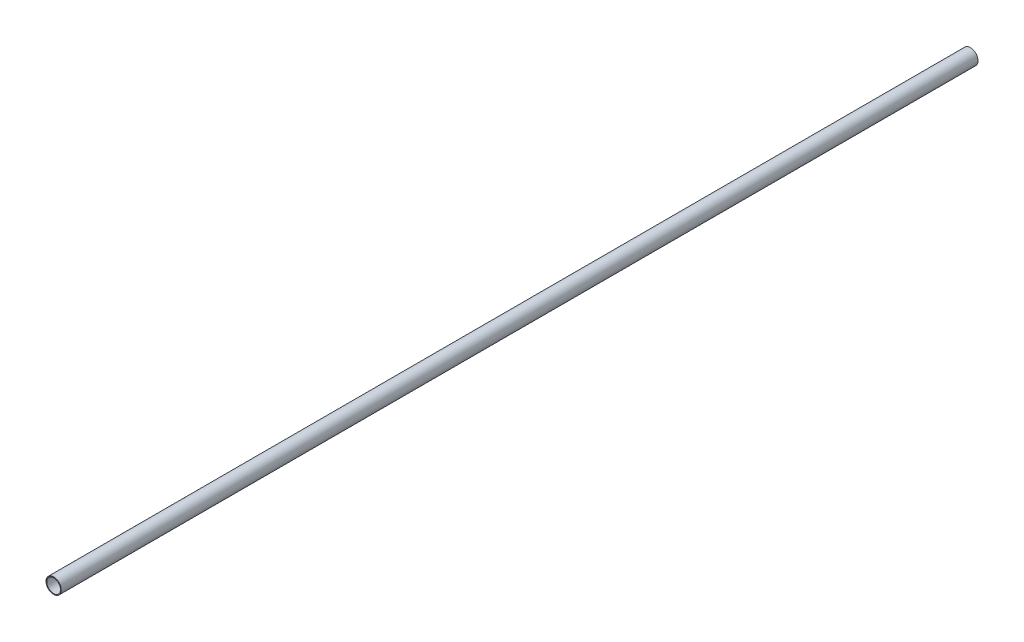
ISO-10303-21;
HEADER;
FILE_DESCRIPTION(('STEP AP214'),'2;1');
FILE_NAME('part.step','',(''),(''),'','','');
FILE_SCHEMA(('AUTOMOTIVE_DESIGN { 1 0 10303 214 1 1 1 1 }'));
ENDSEC;
DATA;
#1=APPLICATION_CONTEXT('core data for automotive mechanical design processes');
#2=APPLICATION_PROTOCOL_DEFINITION('international standard','automotive_design',2000,#1);
#3=PRODUCT_CONTEXT('',#1,'mechanical');
#4=PRODUCT('Part','Part','',(#3));
#5=PRODUCT_RELATED_PRODUCT_CATEGORY('part','',(#4));
#6=PRODUCT_DEFINITION_FORMATION('','',#4);
#7=PRODUCT_DEFINITION_CONTEXT('part definition',#1,'design');
#8=PRODUCT_DEFINITION('design','',#6,#7);
#9=PRODUCT_DEFINITION_SHAPE('','',#8);
#10=(LENGTH_UNIT() NAMED_UNIT(*) SI_UNIT(.MILLI.,.METRE.));
#11=(NAMED_UNIT(*) PLANE_ANGLE_UNIT() SI_UNIT($,.RADIAN.));
#12=(NAMED_UNIT(*) SI_UNIT($,.STERADIAN.) SOLID_ANGLE_UNIT());
#13=UNCERTAINTY_MEASURE_WITH_UNIT(LENGTH_MEASURE(1.E-05),#10,'distance_accuracy_value','');
#14=(GEOMETRIC_REPRESENTATION_CONTEXT(3) GLOBAL_UNCERTAINTY_ASSIGNED_CONTEXT((#13)) GLOBAL_UNIT_ASSIGNED_CONTEXT((#10,
#11,#12)) REPRESENTATION_CONTEXT('',''));
#15=CARTESIAN_POINT('',(0.,0.,0.));
#16=DIRECTION('',(0.,0.,1.));
#17=DIRECTION('',(1.,0.,0.));
#18=AXIS2_PLACEMENT_3D('',#15,#16,#17);
#19=CARTESIAN_POINT('',(0.,0.,-12.7));
#20=DIRECTION('',(0.,0.,1.));
#21=DIRECTION('',(1.,0.,0.));
#22=AXIS2_PLACEMENT_3D('',#19,#20,#21);
#23=CYLINDRICAL_SURFACE('',#22,2.8575);
#24=CARTESIAN_POINT('',(0.,0.,-12.7));
#25=DIRECTION('',(0.,0.,1.));
#26=DIRECTION('',(1.,0.,0.));
#27=AXIS2_PLACEMENT_3D('',#24,#25,#26);
#28=CIRCLE('',#27,2.8575);
#29=CARTESIAN_POINT('',(2.8575,0.,-12.7));
#30=VERTEX_POINT('',#29);
#31=EDGE_CURVE('E39',#30,#30,#28,.T.);
#32=ORIENTED_EDGE('',*,*,#31,.F.);
#33=EDGE_LOOP('',(#32));
#34=FACE_BOUND('',#33,.T.);
#35=CARTESIAN_POINT('',(0.,0.,368.3));
#36=DIRECTION('',(0.,0.,1.));
#37=DIRECTION('',(1.,0.,0.));
#38=AXIS2_PLACEMENT_3D('',#35,#36,#37);
#39=CIRCLE('',#38,2.8575);
#40=CARTESIAN_POINT('',(2.8575,0.,368.3));
#41=VERTEX_POINT('',#40);
#42=EDGE_CURVE('E47',#41,#41,#39,.T.);
#43=ORIENTED_EDGE('',*,*,#42,.T.);
#44=EDGE_LOOP('',(#43));
#45=FACE_BOUND('',#44,.T.);
#46=ADVANCED_FACE('F33',(#34,#45),#23,.F.);
#47=CARTESIAN_POINT('',(0.,0.,-12.7));
#48=DIRECTION('',(0.,0.,1.));
#49=DIRECTION('',(1.,0.,0.));
#50=AXIS2_PLACEMENT_3D('',#47,#48,#49);
#51=CYLINDRICAL_SURFACE('',#50,3.175);
#52=CARTESIAN_POINT('',(0.,0.,-12.7));
#53=DIRECTION('',(0.,0.,1.));
#54=DIRECTION('',(1.,0.,0.));
#55=AXIS2_PLACEMENT_3D('',#52,#53,#54);
#56=CIRCLE('',#55,3.175);
#57=CARTESIAN_POINT('',(3.175,0.,-12.7));
#58=VERTEX_POINT('',#57);
#59=EDGE_CURVE('E10',#58,#58,#56,.T.);
#60=ORIENTED_EDGE('',*,*,#59,.T.);
#61=EDGE_LOOP('',(#60));
#62=FACE_BOUND('',#61,.T.);
#63=CARTESIAN_POINT('',(0.,0.,368.3));
#64=DIRECTION('',(0.,0.,1.));
#65=DIRECTION('',(1.,0.,0.));
#66=AXIS2_PLACEMENT_3D('',#63,#64,#65);
#67=CIRCLE('',#66,3.175);
#68=CARTESIAN_POINT('',(3.175,0.,368.3));
#69=VERTEX_POINT('',#68);
#70=EDGE_CURVE('E43',#69,#69,#67,.T.);
#71=ORIENTED_EDGE('',*,*,#70,.F.);
#72=EDGE_LOOP('',(#71));
#73=FACE_BOUND('',#72,.T.);
#74=ADVANCED_FACE('F61',(#62,#73),#51,.T.);
#75=CARTESIAN_POINT('',(0.,0.,-12.7));
#76=DIRECTION('',(0.,0.,1.));
#77=DIRECTION('',(1.,0.,0.));
#78=AXIS2_PLACEMENT_3D('',#75,#76,#77);
#79=PLANE('',#78);
#80=ORIENTED_EDGE('',*,*,#31,.T.);
#81=EDGE_LOOP('',(#80));
#82=FACE_BOUND('',#81,.T.);
#83=ORIENTED_EDGE('',*,*,#59,.F.);
#84=EDGE_LOOP('',(#83));
#85=FACE_BOUND('',#84,.T.);
#86=ADVANCED_FACE('F57',(#82,#85),#79,.F.);
#87=CARTESIAN_POINT('',(0.,0.,368.3));
#88=DIRECTION('',(0.,0.,1.));
#89=DIRECTION('',(1.,0.,0.));
#90=AXIS2_PLACEMENT_3D('',#87,#88,#89);
#91=PLANE('',#90);
#92=ORIENTED_EDGE('',*,*,#42,.F.);
#93=EDGE_LOOP('',(#92));
#94=FACE_BOUND('',#93,.T.);
#95=ORIENTED_EDGE('',*,*,#70,.T.);
#96=EDGE_LOOP('',(#95));
#97=FACE_BOUND('',#96,.T.);
#98=ADVANCED_FACE('F54',(#94,#97),#91,.T.);
#99=CLOSED_SHELL('',(#46,#74,#86,#98));
#100=MANIFOLD_SOLID_BREP('B2',#99);
#101=ADVANCED_BREP_SHAPE_REPRESENTATION('',(#18,#100),#14);
#102=SHAPE_DEFINITION_REPRESENTATION(#9,#101);
ENDSEC;
END-ISO-10303-21;
